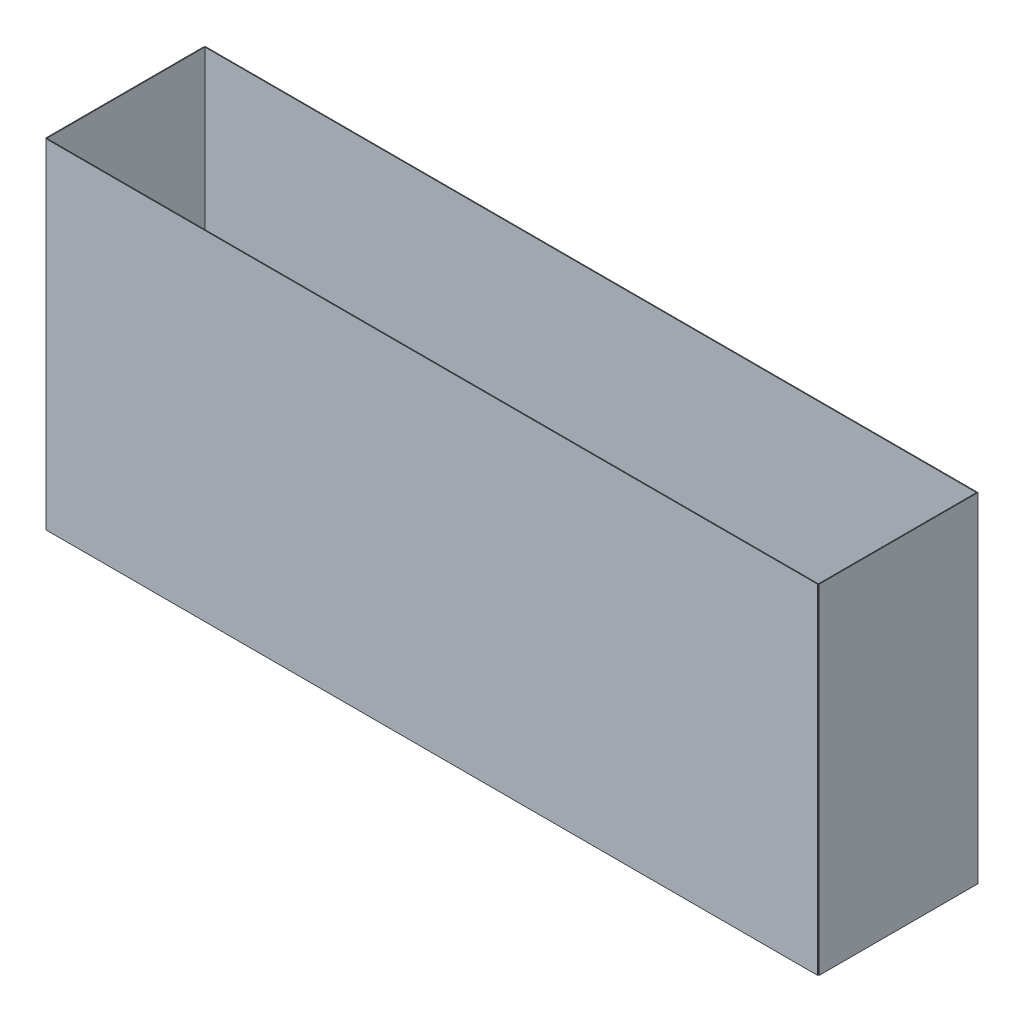
ISO-10303-21;
HEADER;
FILE_DESCRIPTION(('STEP AP214'),'2;1');
FILE_NAME('part.step','',(''),(''),'','','');
FILE_SCHEMA(('AUTOMOTIVE_DESIGN { 1 0 10303 214 1 1 1 1 }'));
ENDSEC;
DATA;
#1=APPLICATION_CONTEXT('core data for automotive mechanical design processes');
#2=APPLICATION_PROTOCOL_DEFINITION('international standard','automotive_design',2000,#1);
#3=PRODUCT_CONTEXT('',#1,'mechanical');
#4=PRODUCT('Part','Part','',(#3));
#5=PRODUCT_RELATED_PRODUCT_CATEGORY('part','',(#4));
#6=PRODUCT_DEFINITION_FORMATION('','',#4);
#7=PRODUCT_DEFINITION_CONTEXT('part definition',#1,'design');
#8=PRODUCT_DEFINITION('design','',#6,#7);
#9=PRODUCT_DEFINITION_SHAPE('','',#8);
#10=(LENGTH_UNIT() NAMED_UNIT(*) SI_UNIT(.MILLI.,.METRE.));
#11=(NAMED_UNIT(*) PLANE_ANGLE_UNIT() SI_UNIT($,.RADIAN.));
#12=(NAMED_UNIT(*) SI_UNIT($,.STERADIAN.) SOLID_ANGLE_UNIT());
#13=UNCERTAINTY_MEASURE_WITH_UNIT(LENGTH_MEASURE(1.E-05),#10,'distance_accuracy_value','');
#14=(GEOMETRIC_REPRESENTATION_CONTEXT(3) GLOBAL_UNCERTAINTY_ASSIGNED_CONTEXT((#13)) GLOBAL_UNIT_ASSIGNED_CONTEXT((#10,
#11,#12)) REPRESENTATION_CONTEXT('',''));
#15=CARTESIAN_POINT('',(0.,0.,0.));
#16=DIRECTION('',(0.,0.,1.));
#17=DIRECTION('',(1.,0.,0.));
#18=AXIS2_PLACEMENT_3D('',#15,#16,#17);
#19=CARTESIAN_POINT('',(-53.1039596557617,17.9348983764648,11.0000019073486));
#20=DIRECTION('',(0.,0.,-1.));
#21=DIRECTION('',(-1.,0.,0.));
#22=AXIS2_PLACEMENT_3D('',#19,#20,#21);
#23=PLANE('',#22);
#24=DIRECTION('',(0.,1.,0.));
#25=VECTOR('',#24,1.);
#26=CARTESIAN_POINT('',(-53.0039596557617,17.9348983764648,11.0000019073486));
#27=LINE('',#26,#25);
#28=CARTESIAN_POINT('',(-53.0039596557617,-27.0651016235352,11.0000019073486));
#29=VERTEX_POINT('',#28);
#30=CARTESIAN_POINT('',(-53.0039596557617,17.9348983764648,11.0000019073486));
#31=VERTEX_POINT('',#30);
#32=EDGE_CURVE('E119',#29,#31,#27,.T.);
#33=ORIENTED_EDGE('',*,*,#32,.T.);
#34=DIRECTION('',(1.,0.,0.));
#35=VECTOR('',#34,1.);
#36=CARTESIAN_POINT('',(-53.1039596557617,17.9348983764648,11.0000019073486));
#37=LINE('',#36,#35);
#38=CARTESIAN_POINT('',(-53.1039596557617,17.9348983764648,11.0000019073486));
#39=VERTEX_POINT('',#38);
#40=EDGE_CURVE('E12',#39,#31,#37,.T.);
#41=ORIENTED_EDGE('',*,*,#40,.F.);
#42=DIRECTION('',(0.,1.,0.));
#43=VECTOR('',#42,1.);
#44=CARTESIAN_POINT('',(-53.1039596557617,17.9348983764648,11.0000019073486));
#45=LINE('',#44,#43);
#46=CARTESIAN_POINT('',(-53.1039596557617,-27.0651016235352,11.0000019073486));
#47=VERTEX_POINT('',#46);
#48=EDGE_CURVE('E107',#47,#39,#45,.T.);
#49=ORIENTED_EDGE('',*,*,#48,.F.);
#50=DIRECTION('',(1.,0.,0.));
#51=VECTOR('',#50,1.);
#52=CARTESIAN_POINT('',(-53.1039596557617,-27.0651016235352,11.0000019073486));
#53=LINE('',#52,#51);
#54=EDGE_CURVE('E115',#47,#29,#53,.T.);
#55=ORIENTED_EDGE('',*,*,#54,.T.);
#56=EDGE_LOOP('',(#33,#41,#49,#55));
#57=FACE_BOUND('',#56,.T.);
#58=ADVANCED_FACE('F56',(#57),#23,.F.);
#59=CARTESIAN_POINT('',(-53.1039596557617,17.9348983764648,11.0000019073486));
#60=DIRECTION('',(0.,-1.,0.));
#61=DIRECTION('',(0.,0.,-1.));
#62=AXIS2_PLACEMENT_3D('',#59,#60,#61);
#63=PLANE('',#62);
#64=DIRECTION('',(0.,0.,-1.));
#65=VECTOR('',#64,1.);
#66=CARTESIAN_POINT('',(-53.0039596557617,17.9348983764648,11.0000019073486));
#67=LINE('',#66,#65);
#68=CARTESIAN_POINT('',(-53.0039596557617,17.9348983764648,-9.99999904632568));
#69=VERTEX_POINT('',#68);
#70=EDGE_CURVE('E111',#31,#69,#67,.T.);
#71=ORIENTED_EDGE('',*,*,#70,.T.);
#72=DIRECTION('',(1.,0.,0.));
#73=VECTOR('',#72,1.);
#74=CARTESIAN_POINT('',(-53.1039596557617,17.9348983764648,-9.99999904632568));
#75=LINE('',#74,#73);
#76=CARTESIAN_POINT('',(-53.1039596557617,17.9348983764648,-9.99999904632568));
#77=VERTEX_POINT('',#76);
#78=EDGE_CURVE('E64',#77,#69,#75,.T.);
#79=ORIENTED_EDGE('',*,*,#78,.F.);
#80=DIRECTION('',(0.,0.,-1.));
#81=VECTOR('',#80,1.);
#82=CARTESIAN_POINT('',(-53.1039596557617,17.9348983764648,11.0000019073486));
#83=LINE('',#82,#81);
#84=EDGE_CURVE('E102',#39,#77,#83,.T.);
#85=ORIENTED_EDGE('',*,*,#84,.F.);
#86=ORIENTED_EDGE('',*,*,#40,.T.);
#87=EDGE_LOOP('',(#71,#79,#85,#86));
#88=FACE_BOUND('',#87,.T.);
#89=ADVANCED_FACE('F110',(#88),#63,.F.);
#90=CARTESIAN_POINT('',(-53.1039596557617,17.9348983764648,-9.99999904632568));
#91=DIRECTION('',(0.,0.,1.));
#92=DIRECTION('',(1.,0.,0.));
#93=AXIS2_PLACEMENT_3D('',#90,#91,#92);
#94=PLANE('',#93);
#95=DIRECTION('',(0.,-1.,0.));
#96=VECTOR('',#95,1.);
#97=CARTESIAN_POINT('',(-53.0039596557617,17.9348983764648,-9.99999904632568));
#98=LINE('',#97,#96);
#99=CARTESIAN_POINT('',(-53.0039596557617,-27.0651016235352,-9.99999904632568));
#100=VERTEX_POINT('',#99);
#101=EDGE_CURVE('E89',#69,#100,#98,.T.);
#102=ORIENTED_EDGE('',*,*,#101,.T.);
#103=DIRECTION('',(1.,0.,0.));
#104=VECTOR('',#103,1.);
#105=CARTESIAN_POINT('',(-53.1039596557617,-27.0651016235352,-9.99999904632568));
#106=LINE('',#105,#104);
#107=CARTESIAN_POINT('',(-53.1039596557617,-27.0651016235352,-9.99999904632568));
#108=VERTEX_POINT('',#107);
#109=EDGE_CURVE('E112',#108,#100,#106,.T.);
#110=ORIENTED_EDGE('',*,*,#109,.F.);
#111=DIRECTION('',(0.,-1.,0.));
#112=VECTOR('',#111,1.);
#113=CARTESIAN_POINT('',(-53.1039596557617,17.9348983764648,-9.99999904632568));
#114=LINE('',#113,#112);
#115=EDGE_CURVE('E105',#77,#108,#114,.T.);
#116=ORIENTED_EDGE('',*,*,#115,.F.);
#117=ORIENTED_EDGE('',*,*,#78,.T.);
#118=EDGE_LOOP('',(#102,#110,#116,#117));
#119=FACE_BOUND('',#118,.T.);
#120=ADVANCED_FACE('F113',(#119),#94,.F.);
#121=CARTESIAN_POINT('',(-53.1039596557617,-27.0651016235352,11.0000019073486));
#122=DIRECTION('',(0.,1.,0.));
#123=DIRECTION('',(0.,0.,1.));
#124=AXIS2_PLACEMENT_3D('',#121,#122,#123);
#125=PLANE('',#124);
#126=DIRECTION('',(0.,0.,1.));
#127=VECTOR('',#126,1.);
#128=CARTESIAN_POINT('',(-53.0039596557617,-27.0651016235352,11.0000019073486));
#129=LINE('',#128,#127);
#130=EDGE_CURVE('E95',#100,#29,#129,.T.);
#131=ORIENTED_EDGE('',*,*,#130,.T.);
#132=ORIENTED_EDGE('',*,*,#54,.F.);
#133=DIRECTION('',(0.,0.,1.));
#134=VECTOR('',#133,1.);
#135=CARTESIAN_POINT('',(-53.1039596557617,-27.0651016235352,11.0000019073486));
#136=LINE('',#135,#134);
#137=EDGE_CURVE('E72',#108,#47,#136,.T.);
#138=ORIENTED_EDGE('',*,*,#137,.F.);
#139=ORIENTED_EDGE('',*,*,#109,.T.);
#140=EDGE_LOOP('',(#131,#132,#138,#139));
#141=FACE_BOUND('',#140,.T.);
#142=ADVANCED_FACE('F126',(#141),#125,.F.);
#143=CARTESIAN_POINT('',(-53.1039596557617,0.,0.));
#144=DIRECTION('',(1.,0.,0.));
#145=DIRECTION('',(0.,0.,-1.));
#146=AXIS2_PLACEMENT_3D('',#143,#144,#145);
#147=PLANE('',#146);
#148=ORIENTED_EDGE('',*,*,#48,.T.);
#149=ORIENTED_EDGE('',*,*,#84,.T.);
#150=ORIENTED_EDGE('',*,*,#115,.T.);
#151=ORIENTED_EDGE('',*,*,#137,.T.);
#152=EDGE_LOOP('',(#148,#149,#150,#151));
#153=FACE_BOUND('',#152,.T.);
#154=ADVANCED_FACE('F103',(#153),#147,.F.);
#155=CARTESIAN_POINT('',(-53.0039596557617,0.,0.));
#156=DIRECTION('',(1.,0.,0.));
#157=DIRECTION('',(0.,0.,-1.));
#158=AXIS2_PLACEMENT_3D('',#155,#156,#157);
#159=PLANE('',#158);
#160=ORIENTED_EDGE('',*,*,#32,.F.);
#161=ORIENTED_EDGE('',*,*,#130,.F.);
#162=ORIENTED_EDGE('',*,*,#101,.F.);
#163=ORIENTED_EDGE('',*,*,#70,.F.);
#164=EDGE_LOOP('',(#160,#161,#162,#163));
#165=FACE_BOUND('',#164,.T.);
#166=ADVANCED_FACE('F129',(#165),#159,.T.);
#167=CLOSED_SHELL('',(#58,#89,#120,#142,#154,#166));
#168=MANIFOLD_SOLID_BREP('B2',#167);
#169=CARTESIAN_POINT('',(49.4960441589355,17.9348983764648,11.1000019073486));
#170=DIRECTION('',(-1.,0.,0.));
#171=DIRECTION('',(0.,-1.,0.));
#172=AXIS2_PLACEMENT_3D('',#169,#170,#171);
#173=PLANE('',#172);
#174=DIRECTION('',(0.,1.,0.));
#175=VECTOR('',#174,1.);
#176=CARTESIAN_POINT('',(49.4960441589355,17.9348983764648,11.0000019073486));
#177=LINE('',#176,#175);
#178=CARTESIAN_POINT('',(49.4960441589356,-27.0651016235352,11.0000019073486));
#179=VERTEX_POINT('',#178);
#180=CARTESIAN_POINT('',(49.4960441589355,17.9348983764648,11.0000019073486));
#181=VERTEX_POINT('',#180);
#182=EDGE_CURVE('E258',#179,#181,#177,.T.);
#183=ORIENTED_EDGE('',*,*,#182,.T.);
#184=DIRECTION('',(0.,0.,-1.));
#185=VECTOR('',#184,1.);
#186=CARTESIAN_POINT('',(49.4960441589355,17.9348983764648,11.1000019073486));
#187=LINE('',#186,#185);
#188=CARTESIAN_POINT('',(49.4960441589355,17.9348983764648,11.1000019073486));
#189=VERTEX_POINT('',#188);
#190=EDGE_CURVE('E54',#189,#181,#187,.T.);
#191=ORIENTED_EDGE('',*,*,#190,.F.);
#192=DIRECTION('',(0.,1.,0.));
#193=VECTOR('',#192,1.);
#194=CARTESIAN_POINT('',(49.4960441589355,17.9348983764648,11.1000019073486));
#195=LINE('',#194,#193);
#196=CARTESIAN_POINT('',(49.4960441589356,-27.0651016235352,11.1000019073486));
#197=VERTEX_POINT('',#196);
#198=EDGE_CURVE('E246',#197,#189,#195,.T.);
#199=ORIENTED_EDGE('',*,*,#198,.F.);
#200=DIRECTION('',(0.,0.,-1.));
#201=VECTOR('',#200,1.);
#202=CARTESIAN_POINT('',(49.4960441589356,-27.0651016235352,11.1000019073486));
#203=LINE('',#202,#201);
#204=EDGE_CURVE('E254',#197,#179,#203,.T.);
#205=ORIENTED_EDGE('',*,*,#204,.T.);
#206=EDGE_LOOP('',(#183,#191,#199,#205));
#207=FACE_BOUND('',#206,.T.);
#208=ADVANCED_FACE('F195',(#207),#173,.F.);
#209=CARTESIAN_POINT('',(49.4960441589355,17.9348983764648,11.1000019073486));
#210=DIRECTION('',(0.,-1.,0.));
#211=DIRECTION('',(1.,0.,0.));
#212=AXIS2_PLACEMENT_3D('',#209,#210,#211);
#213=PLANE('',#212);
#214=DIRECTION('',(-1.,0.,0.));
#215=VECTOR('',#214,1.);
#216=CARTESIAN_POINT('',(49.4960441589355,17.9348983764648,11.0000019073486));
#217=LINE('',#216,#215);
#218=CARTESIAN_POINT('',(-53.0039596557617,17.9348983764648,11.0000019073486));
#219=VERTEX_POINT('',#218);
#220=EDGE_CURVE('E250',#181,#219,#217,.T.);
#221=ORIENTED_EDGE('',*,*,#220,.T.);
#222=DIRECTION('',(0.,0.,-1.));
#223=VECTOR('',#222,1.);
#224=CARTESIAN_POINT('',(-53.0039596557617,17.9348983764648,11.1000019073486));
#225=LINE('',#224,#223);
#226=CARTESIAN_POINT('',(-53.0039596557617,17.9348983764648,11.1000019073486));
#227=VERTEX_POINT('',#226);
#228=EDGE_CURVE('E203',#227,#219,#225,.T.);
#229=ORIENTED_EDGE('',*,*,#228,.F.);
#230=DIRECTION('',(-1.,0.,0.));
#231=VECTOR('',#230,1.);
#232=CARTESIAN_POINT('',(49.4960441589355,17.9348983764648,11.1000019073486));
#233=LINE('',#232,#231);
#234=EDGE_CURVE('E241',#189,#227,#233,.T.);
#235=ORIENTED_EDGE('',*,*,#234,.F.);
#236=ORIENTED_EDGE('',*,*,#190,.T.);
#237=EDGE_LOOP('',(#221,#229,#235,#236));
#238=FACE_BOUND('',#237,.T.);
#239=ADVANCED_FACE('F249',(#238),#213,.F.);
#240=CARTESIAN_POINT('',(-53.0039596557617,17.9348983764648,11.1000019073486));
#241=DIRECTION('',(1.,0.,0.));
#242=DIRECTION('',(0.,1.,0.));
#243=AXIS2_PLACEMENT_3D('',#240,#241,#242);
#244=PLANE('',#243);
#245=DIRECTION('',(0.,-1.,0.));
#246=VECTOR('',#245,1.);
#247=CARTESIAN_POINT('',(-53.0039596557617,17.9348983764648,11.0000019073486));
#248=LINE('',#247,#246);
#249=CARTESIAN_POINT('',(-53.0039596557617,-27.0651016235352,11.0000019073486));
#250=VERTEX_POINT('',#249);
#251=EDGE_CURVE('E228',#219,#250,#248,.T.);
#252=ORIENTED_EDGE('',*,*,#251,.T.);
#253=DIRECTION('',(0.,0.,-1.));
#254=VECTOR('',#253,1.);
#255=CARTESIAN_POINT('',(-53.0039596557617,-27.0651016235352,11.1000019073486));
#256=LINE('',#255,#254);
#257=CARTESIAN_POINT('',(-53.0039596557617,-27.0651016235352,11.1000019073486));
#258=VERTEX_POINT('',#257);
#259=EDGE_CURVE('E251',#258,#250,#256,.T.);
#260=ORIENTED_EDGE('',*,*,#259,.F.);
#261=DIRECTION('',(0.,-1.,0.));
#262=VECTOR('',#261,1.);
#263=CARTESIAN_POINT('',(-53.0039596557617,17.9348983764648,11.1000019073486));
#264=LINE('',#263,#262);
#265=EDGE_CURVE('E244',#227,#258,#264,.T.);
#266=ORIENTED_EDGE('',*,*,#265,.F.);
#267=ORIENTED_EDGE('',*,*,#228,.T.);
#268=EDGE_LOOP('',(#252,#260,#266,#267));
#269=FACE_BOUND('',#268,.T.);
#270=ADVANCED_FACE('F252',(#269),#244,.F.);
#271=CARTESIAN_POINT('',(49.4960441589356,-27.0651016235352,11.1000019073486));
#272=DIRECTION('',(0.,1.,0.));
#273=DIRECTION('',(-1.,0.,0.));
#274=AXIS2_PLACEMENT_3D('',#271,#272,#273);
#275=PLANE('',#274);
#276=DIRECTION('',(1.,0.,0.));
#277=VECTOR('',#276,1.);
#278=CARTESIAN_POINT('',(49.4960441589356,-27.0651016235352,11.0000019073486));
#279=LINE('',#278,#277);
#280=EDGE_CURVE('E234',#250,#179,#279,.T.);
#281=ORIENTED_EDGE('',*,*,#280,.T.);
#282=ORIENTED_EDGE('',*,*,#204,.F.);
#283=DIRECTION('',(1.,0.,0.));
#284=VECTOR('',#283,1.);
#285=CARTESIAN_POINT('',(49.4960441589356,-27.0651016235352,11.1000019073486));
#286=LINE('',#285,#284);
#287=EDGE_CURVE('E211',#258,#197,#286,.T.);
#288=ORIENTED_EDGE('',*,*,#287,.F.);
#289=ORIENTED_EDGE('',*,*,#259,.T.);
#290=EDGE_LOOP('',(#281,#282,#288,#289));
#291=FACE_BOUND('',#290,.T.);
#292=ADVANCED_FACE('F265',(#291),#275,.F.);
#293=CARTESIAN_POINT('',(0.,0.,11.1000019073486));
#294=DIRECTION('',(0.,0.,-1.));
#295=DIRECTION('',(-1.,0.,0.));
#296=AXIS2_PLACEMENT_3D('',#293,#294,#295);
#297=PLANE('',#296);
#298=ORIENTED_EDGE('',*,*,#198,.T.);
#299=ORIENTED_EDGE('',*,*,#234,.T.);
#300=ORIENTED_EDGE('',*,*,#265,.T.);
#301=ORIENTED_EDGE('',*,*,#287,.T.);
#302=EDGE_LOOP('',(#298,#299,#300,#301));
#303=FACE_BOUND('',#302,.T.);
#304=ADVANCED_FACE('F242',(#303),#297,.F.);
#305=CARTESIAN_POINT('',(0.,0.,11.0000019073486));
#306=DIRECTION('',(0.,0.,-1.));
#307=DIRECTION('',(-1.,0.,0.));
#308=AXIS2_PLACEMENT_3D('',#305,#306,#307);
#309=PLANE('',#308);
#310=ORIENTED_EDGE('',*,*,#182,.F.);
#311=ORIENTED_EDGE('',*,*,#280,.F.);
#312=ORIENTED_EDGE('',*,*,#251,.F.);
#313=ORIENTED_EDGE('',*,*,#220,.F.);
#314=EDGE_LOOP('',(#310,#311,#312,#313));
#315=FACE_BOUND('',#314,.T.);
#316=ADVANCED_FACE('F268',(#315),#309,.T.);
#317=CLOSED_SHELL('',(#208,#239,#270,#292,#304,#316));
#318=MANIFOLD_SOLID_BREP('B6',#317);
#319=CARTESIAN_POINT('',(-53.0039596557617,-27.0651016235352,-10.0999990463257));
#320=DIRECTION('',(0.,1.,0.));
#321=DIRECTION('',(0.,0.,1.));
#322=AXIS2_PLACEMENT_3D('',#319,#320,#321);
#323=PLANE('',#322);
#324=DIRECTION('',(-1.,0.,0.));
#325=VECTOR('',#324,1.);
#326=CARTESIAN_POINT('',(-53.0039596557617,-27.0651016235352,-9.99999904632568));
#327=LINE('',#326,#325);
#328=CARTESIAN_POINT('',(49.4960441589356,-27.0651016235352,-9.99999904632568));
#329=VERTEX_POINT('',#328);
#330=CARTESIAN_POINT('',(-53.0039596557617,-27.0651016235352,-9.99999904632568));
#331=VERTEX_POINT('',#330);
#332=EDGE_CURVE('E375',#329,#331,#327,.T.);
#333=ORIENTED_EDGE('',*,*,#332,.T.);
#334=DIRECTION('',(0.,0.,1.));
#335=VECTOR('',#334,1.);
#336=CARTESIAN_POINT('',(-53.0039596557617,-27.0651016235352,-10.0999990463257));
#337=LINE('',#336,#335);
#338=CARTESIAN_POINT('',(-53.0039596557617,-27.0651016235352,-10.0999990463257));
#339=VERTEX_POINT('',#338);
#340=EDGE_CURVE('E193',#339,#331,#337,.T.);
#341=ORIENTED_EDGE('',*,*,#340,.F.);
#342=DIRECTION('',(-1.,0.,0.));
#343=VECTOR('',#342,1.);
#344=CARTESIAN_POINT('',(-53.0039596557617,-27.0651016235352,-10.0999990463257));
#345=LINE('',#344,#343);
#346=CARTESIAN_POINT('',(49.5960441589356,-27.0651016235352,-10.0999990463257));
#347=VERTEX_POINT('',#346);
#348=EDGE_CURVE('E369',#347,#339,#345,.T.);
#349=ORIENTED_EDGE('',*,*,#348,.F.);
#350=DIRECTION('',(0.,0.,-1.));
#351=VECTOR('',#350,1.);
#352=CARTESIAN_POINT('',(49.5960441589356,-27.0651016235352,-10.0999990463257));
#353=LINE('',#352,#351);
#354=CARTESIAN_POINT('',(49.5960441589356,-27.0651016235352,11.0000019073486));
#355=VERTEX_POINT('',#354);
#356=EDGE_CURVE('E389',#355,#347,#353,.T.);
#357=ORIENTED_EDGE('',*,*,#356,.F.);
#358=DIRECTION('',(-1.,0.,0.));
#359=VECTOR('',#358,1.);
#360=CARTESIAN_POINT('',(49.5960441589356,-27.0651016235352,11.0000019073486));
#361=LINE('',#360,#359);
#362=CARTESIAN_POINT('',(49.4960441589356,-27.0651016235352,11.0000019073486));
#363=VERTEX_POINT('',#362);
#364=EDGE_CURVE('E394',#355,#363,#361,.T.);
#365=ORIENTED_EDGE('',*,*,#364,.T.);
#366=DIRECTION('',(0.,0.,-1.));
#367=VECTOR('',#366,1.);
#368=CARTESIAN_POINT('',(49.4960441589356,-27.0651016235352,-10.0999990463257));
#369=LINE('',#368,#367);
#370=EDGE_CURVE('E386',#363,#329,#369,.T.);
#371=ORIENTED_EDGE('',*,*,#370,.T.);
#372=EDGE_LOOP('',(#333,#341,#349,#357,#365,#371));
#373=FACE_BOUND('',#372,.T.);
#374=ADVANCED_FACE('F325',(#373),#323,.F.);
#375=CARTESIAN_POINT('',(-53.0039596557617,-27.0651016235352,-10.0999990463257));
#376=DIRECTION('',(1.,0.,0.));
#377=DIRECTION('',(0.,0.,-1.));
#378=AXIS2_PLACEMENT_3D('',#375,#376,#377);
#379=PLANE('',#378);
#380=DIRECTION('',(0.,1.,0.));
#381=VECTOR('',#380,1.);
#382=CARTESIAN_POINT('',(-53.0039596557617,-27.0651016235352,-9.99999904632568));
#383=LINE('',#382,#381);
#384=CARTESIAN_POINT('',(-53.0039596557617,17.9348983764648,-9.99999904632568));
#385=VERTEX_POINT('',#384);
#386=EDGE_CURVE('E353',#331,#385,#383,.T.);
#387=ORIENTED_EDGE('',*,*,#386,.T.);
#388=DIRECTION('',(0.,0.,1.));
#389=VECTOR('',#388,1.);
#390=CARTESIAN_POINT('',(-53.0039596557617,17.9348983764648,-10.0999990463257));
#391=LINE('',#390,#389);
#392=CARTESIAN_POINT('',(-53.0039596557617,17.9348983764648,-10.0999990463257));
#393=VERTEX_POINT('',#392);
#394=EDGE_CURVE('E333',#393,#385,#391,.T.);
#395=ORIENTED_EDGE('',*,*,#394,.F.);
#396=DIRECTION('',(0.,1.,0.));
#397=VECTOR('',#396,1.);
#398=CARTESIAN_POINT('',(-53.0039596557617,-27.0651016235352,-10.0999990463257));
#399=LINE('',#398,#397);
#400=EDGE_CURVE('E341',#339,#393,#399,.T.);
#401=ORIENTED_EDGE('',*,*,#400,.F.);
#402=ORIENTED_EDGE('',*,*,#340,.T.);
#403=EDGE_LOOP('',(#387,#395,#401,#402));
#404=FACE_BOUND('',#403,.T.);
#405=ADVANCED_FACE('F406',(#404),#379,.F.);
#406=CARTESIAN_POINT('',(-53.0039596557617,17.9348983764648,-10.0999990463257));
#407=DIRECTION('',(0.,-1.,0.));
#408=DIRECTION('',(0.,0.,-1.));
#409=AXIS2_PLACEMENT_3D('',#406,#407,#408);
#410=PLANE('',#409);
#411=DIRECTION('',(1.,0.,0.));
#412=VECTOR('',#411,1.);
#413=CARTESIAN_POINT('',(-53.0039596557617,17.9348983764648,-9.99999904632568));
#414=LINE('',#413,#412);
#415=CARTESIAN_POINT('',(49.4960441589355,17.9348983764648,-9.99999904632568));
#416=VERTEX_POINT('',#415);
#417=EDGE_CURVE('E359',#385,#416,#414,.T.);
#418=ORIENTED_EDGE('',*,*,#417,.T.);
#419=DIRECTION('',(0.,0.,1.));
#420=VECTOR('',#419,1.);
#421=CARTESIAN_POINT('',(49.4960441589356,17.9348983764648,-10.0999990463257));
#422=LINE('',#421,#420);
#423=CARTESIAN_POINT('',(49.4960441589356,17.9348983764648,11.0000019073486));
#424=VERTEX_POINT('',#423);
#425=EDGE_CURVE('E365',#416,#424,#422,.T.);
#426=ORIENTED_EDGE('',*,*,#425,.T.);
#427=DIRECTION('',(-1.,0.,0.));
#428=VECTOR('',#427,1.);
#429=CARTESIAN_POINT('',(49.5960441589356,17.9348983764648,11.0000019073486));
#430=LINE('',#429,#428);
#431=CARTESIAN_POINT('',(49.5960441589356,17.9348983764648,11.0000019073486));
#432=VERTEX_POINT('',#431);
#433=EDGE_CURVE('E379',#432,#424,#430,.T.);
#434=ORIENTED_EDGE('',*,*,#433,.F.);
#435=DIRECTION('',(0.,0.,1.));
#436=VECTOR('',#435,1.);
#437=CARTESIAN_POINT('',(49.5960441589356,17.9348983764648,-10.0999990463257));
#438=LINE('',#437,#436);
#439=CARTESIAN_POINT('',(49.5960441589356,17.9348983764648,-10.0999990463257));
#440=VERTEX_POINT('',#439);
#441=EDGE_CURVE('E410',#440,#432,#438,.T.);
#442=ORIENTED_EDGE('',*,*,#441,.F.);
#443=DIRECTION('',(1.,0.,0.));
#444=VECTOR('',#443,1.);
#445=CARTESIAN_POINT('',(-53.0039596557617,17.9348983764648,-10.0999990463257));
#446=LINE('',#445,#444);
#447=EDGE_CURVE('E400',#393,#440,#446,.T.);
#448=ORIENTED_EDGE('',*,*,#447,.F.);
#449=ORIENTED_EDGE('',*,*,#394,.T.);
#450=EDGE_LOOP('',(#418,#426,#434,#442,#448,#449));
#451=FACE_BOUND('',#450,.T.);
#452=ADVANCED_FACE('F361',(#451),#410,.F.);
#453=CARTESIAN_POINT('',(0.,0.,-10.0999990463257));
#454=DIRECTION('',(0.,0.,-1.));
#455=DIRECTION('',(-1.,0.,0.));
#456=AXIS2_PLACEMENT_3D('',#453,#454,#455);
#457=PLANE('',#456);
#458=ORIENTED_EDGE('',*,*,#447,.T.);
#459=DIRECTION('',(0.,1.,0.));
#460=VECTOR('',#459,1.);
#461=CARTESIAN_POINT('',(49.5960441589356,-27.0651016235352,-10.0999990463257));
#462=LINE('',#461,#460);
#463=EDGE_CURVE('E393',#347,#440,#462,.T.);
#464=ORIENTED_EDGE('',*,*,#463,.F.);
#465=ORIENTED_EDGE('',*,*,#348,.T.);
#466=ORIENTED_EDGE('',*,*,#400,.T.);
#467=EDGE_LOOP('',(#458,#464,#465,#466));
#468=FACE_BOUND('',#467,.T.);
#469=ADVANCED_FACE('F413',(#468),#457,.T.);
#470=CARTESIAN_POINT('',(0.,0.,-9.99999904632568));
#471=DIRECTION('',(0.,0.,-1.));
#472=DIRECTION('',(-1.,0.,0.));
#473=AXIS2_PLACEMENT_3D('',#470,#471,#472);
#474=PLANE('',#473);
#475=DIRECTION('',(0.,-1.,0.));
#476=VECTOR('',#475,1.);
#477=CARTESIAN_POINT('',(49.4960441589355,-27.0651016235352,-9.99999904632568));
#478=LINE('',#477,#476);
#479=EDGE_CURVE('E373',#416,#329,#478,.T.);
#480=ORIENTED_EDGE('',*,*,#479,.F.);
#481=ORIENTED_EDGE('',*,*,#417,.F.);
#482=ORIENTED_EDGE('',*,*,#386,.F.);
#483=ORIENTED_EDGE('',*,*,#332,.F.);
#484=EDGE_LOOP('',(#480,#481,#482,#483));
#485=FACE_BOUND('',#484,.T.);
#486=ADVANCED_FACE('F374',(#485),#474,.F.);
#487=CARTESIAN_POINT('',(49.4960441589356,0.,0.));
#488=DIRECTION('',(1.,0.,0.));
#489=DIRECTION('',(0.,0.,-1.));
#490=AXIS2_PLACEMENT_3D('',#487,#488,#489);
#491=PLANE('',#490);
#492=ORIENTED_EDGE('',*,*,#425,.F.);
#493=ORIENTED_EDGE('',*,*,#479,.T.);
#494=ORIENTED_EDGE('',*,*,#370,.F.);
#495=DIRECTION('',(0.,-1.,0.));
#496=VECTOR('',#495,1.);
#497=CARTESIAN_POINT('',(49.4960441589356,-27.0651016235352,11.0000019073486));
#498=LINE('',#497,#496);
#499=EDGE_CURVE('E384',#424,#363,#498,.T.);
#500=ORIENTED_EDGE('',*,*,#499,.F.);
#501=EDGE_LOOP('',(#492,#493,#494,#500));
#502=FACE_BOUND('',#501,.T.);
#503=ADVANCED_FACE('F382',(#502),#491,.F.);
#504=CARTESIAN_POINT('',(49.5960441589356,-27.0651016235352,11.0000019073486));
#505=DIRECTION('',(0.,0.,-1.));
#506=DIRECTION('',(0.,1.,0.));
#507=AXIS2_PLACEMENT_3D('',#504,#505,#506);
#508=PLANE('',#507);
#509=ORIENTED_EDGE('',*,*,#499,.T.);
#510=ORIENTED_EDGE('',*,*,#364,.F.);
#511=DIRECTION('',(0.,-1.,0.));
#512=VECTOR('',#511,1.);
#513=CARTESIAN_POINT('',(49.5960441589356,-27.0651016235352,11.0000019073486));
#514=LINE('',#513,#512);
#515=EDGE_CURVE('E430',#432,#355,#514,.T.);
#516=ORIENTED_EDGE('',*,*,#515,.F.);
#517=ORIENTED_EDGE('',*,*,#433,.T.);
#518=EDGE_LOOP('',(#509,#510,#516,#517));
#519=FACE_BOUND('',#518,.T.);
#520=ADVANCED_FACE('F435',(#519),#508,.F.);
#521=CARTESIAN_POINT('',(49.5960441589356,0.,0.));
#522=DIRECTION('',(1.,0.,0.));
#523=DIRECTION('',(0.,0.,-1.));
#524=AXIS2_PLACEMENT_3D('',#521,#522,#523);
#525=PLANE('',#524);
#526=ORIENTED_EDGE('',*,*,#463,.T.);
#527=ORIENTED_EDGE('',*,*,#441,.T.);
#528=ORIENTED_EDGE('',*,*,#515,.T.);
#529=ORIENTED_EDGE('',*,*,#356,.T.);
#530=EDGE_LOOP('',(#526,#527,#528,#529));
#531=FACE_BOUND('',#530,.T.);
#532=ADVANCED_FACE('F428',(#531),#525,.T.);
#533=CLOSED_SHELL('',(#374,#405,#452,#469,#486,#503,#520,#532));
#534=MANIFOLD_SOLID_BREP('B48',#533);
#535=ADVANCED_BREP_SHAPE_REPRESENTATION('',(#18,#168,#318,#534),#14);
#536=SHAPE_DEFINITION_REPRESENTATION(#9,#535);
ENDSEC;
END-ISO-10303-21;
